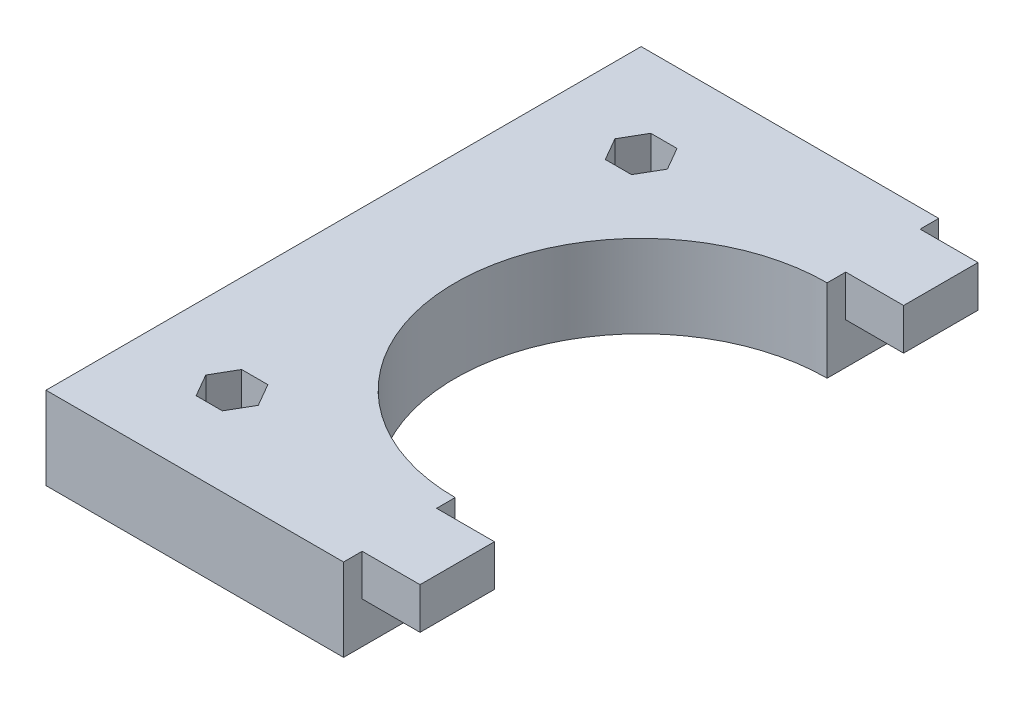
ISO-10303-21;
HEADER;
FILE_DESCRIPTION(('STEP AP214'),'2;1');
FILE_NAME('part.step','',(''),(''),'','','');
FILE_SCHEMA(('AUTOMOTIVE_DESIGN { 1 0 10303 214 1 1 1 1 }'));
ENDSEC;
DATA;
#1=APPLICATION_CONTEXT('core data for automotive mechanical design processes');
#2=APPLICATION_PROTOCOL_DEFINITION('international standard','automotive_design',2000,#1);
#3=PRODUCT_CONTEXT('',#1,'mechanical');
#4=PRODUCT('Part','Part','',(#3));
#5=PRODUCT_RELATED_PRODUCT_CATEGORY('part','',(#4));
#6=PRODUCT_DEFINITION_FORMATION('','',#4);
#7=PRODUCT_DEFINITION_CONTEXT('part definition',#1,'design');
#8=PRODUCT_DEFINITION('design','',#6,#7);
#9=PRODUCT_DEFINITION_SHAPE('','',#8);
#10=(LENGTH_UNIT() NAMED_UNIT(*) SI_UNIT(.MILLI.,.METRE.));
#11=(NAMED_UNIT(*) PLANE_ANGLE_UNIT() SI_UNIT($,.RADIAN.));
#12=(NAMED_UNIT(*) SI_UNIT($,.STERADIAN.) SOLID_ANGLE_UNIT());
#13=UNCERTAINTY_MEASURE_WITH_UNIT(LENGTH_MEASURE(1.E-05),#10,'distance_accuracy_value','');
#14=(GEOMETRIC_REPRESENTATION_CONTEXT(3) GLOBAL_UNCERTAINTY_ASSIGNED_CONTEXT((#13)) GLOBAL_UNIT_ASSIGNED_CONTEXT((#10,
#11,#12)) REPRESENTATION_CONTEXT('',''));
#15=CARTESIAN_POINT('',(0.,0.,0.));
#16=DIRECTION('',(0.,0.,1.));
#17=DIRECTION('',(1.,0.,0.));
#18=AXIS2_PLACEMENT_3D('',#15,#16,#17);
#19=CARTESIAN_POINT('',(0.,-5.,0.));
#20=DIRECTION('',(-1.,0.,0.));
#21=DIRECTION('',(0.,0.,1.));
#22=AXIS2_PLACEMENT_3D('',#19,#20,#21);
#23=PLANE('',#22);
#24=DIRECTION('',(0.,1.,0.));
#25=VECTOR('',#24,1.);
#26=CARTESIAN_POINT('',(0.,0.,-33.75));
#27=LINE('',#26,#25);
#28=CARTESIAN_POINT('',(0.,0.,-33.75));
#29=VERTEX_POINT('',#28);
#30=CARTESIAN_POINT('',(0.,5.,-33.75));
#31=VERTEX_POINT('',#30);
#32=EDGE_CURVE('E65',#29,#31,#27,.T.);
#33=ORIENTED_EDGE('',*,*,#32,.F.);
#34=DIRECTION('',(0.,0.,-1.));
#35=VECTOR('',#34,1.);
#36=CARTESIAN_POINT('',(0.,0.,-24.75));
#37=LINE('',#36,#35);
#38=CARTESIAN_POINT('',(0.,0.,-24.75));
#39=VERTEX_POINT('',#38);
#40=EDGE_CURVE('E70',#39,#29,#37,.T.);
#41=ORIENTED_EDGE('',*,*,#40,.F.);
#42=DIRECTION('',(0.,1.,0.));
#43=VECTOR('',#42,1.);
#44=CARTESIAN_POINT('',(0.,0.,-24.75));
#45=LINE('',#44,#43);
#46=CARTESIAN_POINT('',(0.,5.,-24.75));
#47=VERTEX_POINT('',#46);
#48=EDGE_CURVE('E243',#39,#47,#45,.T.);
#49=ORIENTED_EDGE('',*,*,#48,.T.);
#50=DIRECTION('',(0.,0.,1.));
#51=VECTOR('',#50,1.);
#52=CARTESIAN_POINT('',(0.,5.,0.));
#53=LINE('',#52,#51);
#54=CARTESIAN_POINT('',(0.,5.,-22.5));
#55=VERTEX_POINT('',#54);
#56=EDGE_CURVE('E442',#47,#55,#53,.T.);
#57=ORIENTED_EDGE('',*,*,#56,.T.);
#58=DIRECTION('',(0.,1.,0.));
#59=VECTOR('',#58,1.);
#60=CARTESIAN_POINT('',(0.,-5.,-22.5));
#61=LINE('',#60,#59);
#62=CARTESIAN_POINT('',(0.,-5.,-22.5));
#63=VERTEX_POINT('',#62);
#64=EDGE_CURVE('E498',#63,#55,#61,.T.);
#65=ORIENTED_EDGE('',*,*,#64,.F.);
#66=DIRECTION('',(0.,0.,1.));
#67=VECTOR('',#66,1.);
#68=CARTESIAN_POINT('',(0.,-5.,0.));
#69=LINE('',#68,#67);
#70=CARTESIAN_POINT('',(0.,-5.,-36.));
#71=VERTEX_POINT('',#70);
#72=EDGE_CURVE('E472',#71,#63,#69,.T.);
#73=ORIENTED_EDGE('',*,*,#72,.F.);
#74=DIRECTION('',(0.,1.,0.));
#75=VECTOR('',#74,1.);
#76=CARTESIAN_POINT('',(0.,-5.,-36.));
#77=LINE('',#76,#75);
#78=CARTESIAN_POINT('',(0.,5.,-36.));
#79=VERTEX_POINT('',#78);
#80=EDGE_CURVE('E495',#71,#79,#77,.T.);
#81=ORIENTED_EDGE('',*,*,#80,.T.);
#82=EDGE_CURVE('E443',#79,#31,#53,.T.);
#83=ORIENTED_EDGE('',*,*,#82,.T.);
#84=EDGE_LOOP('',(#33,#41,#49,#57,#65,#73,#81,#83));
#85=FACE_BOUND('',#84,.T.);
#86=ADVANCED_FACE('F47',(#85),#23,.F.);
#87=CARTESIAN_POINT('',(-24.7487373415292,-5.,24.7487373415292));
#88=DIRECTION('',(0.,1.,0.));
#89=DIRECTION('',(0.,0.,1.));
#90=AXIS2_PLACEMENT_3D('',#87,#88,#89);
#91=CYLINDRICAL_SURFACE('',#90,1.5);
#92=CARTESIAN_POINT('',(-24.7487373415292,-5.,24.7487373415292));
#93=DIRECTION('',(0.,1.,0.));
#94=DIRECTION('',(0.,0.,1.));
#95=AXIS2_PLACEMENT_3D('',#92,#93,#94);
#96=CIRCLE('',#95,1.5);
#97=CARTESIAN_POINT('',(-24.7487373415292,-5.,26.2487373415292));
#98=VERTEX_POINT('',#97);
#99=EDGE_CURVE('E460',#98,#98,#96,.T.);
#100=ORIENTED_EDGE('',*,*,#99,.F.);
#101=EDGE_LOOP('',(#100));
#102=FACE_BOUND('',#101,.T.);
#103=CARTESIAN_POINT('',(-24.7487373415292,0.,24.7487373415292));
#104=DIRECTION('',(0.,1.,0.));
#105=DIRECTION('',(0.,0.,1.));
#106=AXIS2_PLACEMENT_3D('',#103,#104,#105);
#107=CIRCLE('',#106,1.5);
#108=CARTESIAN_POINT('',(-24.7487373415292,0.,26.2487373415292));
#109=VERTEX_POINT('',#108);
#110=EDGE_CURVE('E51',#109,#109,#107,.F.);
#111=ORIENTED_EDGE('',*,*,#110,.F.);
#112=EDGE_LOOP('',(#111));
#113=FACE_BOUND('',#112,.T.);
#114=ADVANCED_FACE('F49',(#102,#113),#91,.F.);
#115=CARTESIAN_POINT('',(0.,5.,0.));
#116=DIRECTION('',(0.,1.,0.));
#117=DIRECTION('',(0.,0.,1.));
#118=AXIS2_PLACEMENT_3D('',#115,#116,#117);
#119=PLANE('',#118);
#120=CARTESIAN_POINT('',(0.,5.,0.));
#121=DIRECTION('',(0.,1.,0.));
#122=DIRECTION('',(0.,0.,1.));
#123=AXIS2_PLACEMENT_3D('',#120,#121,#122);
#124=CIRCLE('',#123,22.5);
#125=CARTESIAN_POINT('',(0.,5.,22.5));
#126=VERTEX_POINT('',#125);
#127=EDGE_CURVE('E438',#55,#126,#124,.T.);
#128=ORIENTED_EDGE('',*,*,#127,.F.);
#129=ORIENTED_EDGE('',*,*,#56,.F.);
#130=DIRECTION('',(-1.,0.,0.));
#131=VECTOR('',#130,1.);
#132=CARTESIAN_POINT('',(0.,5.,-24.75));
#133=LINE('',#132,#131);
#134=CARTESIAN_POINT('',(7.,5.,-24.75));
#135=VERTEX_POINT('',#134);
#136=EDGE_CURVE('E254',#135,#47,#133,.T.);
#137=ORIENTED_EDGE('',*,*,#136,.F.);
#138=DIRECTION('',(0.,0.,1.));
#139=VECTOR('',#138,1.);
#140=CARTESIAN_POINT('',(7.,5.,-24.75));
#141=LINE('',#140,#139);
#142=CARTESIAN_POINT('',(7.,5.,-33.75));
#143=VERTEX_POINT('',#142);
#144=EDGE_CURVE('E237',#143,#135,#141,.T.);
#145=ORIENTED_EDGE('',*,*,#144,.F.);
#146=DIRECTION('',(1.,0.,0.));
#147=VECTOR('',#146,1.);
#148=CARTESIAN_POINT('',(0.,5.,-33.75));
#149=LINE('',#148,#147);
#150=EDGE_CURVE('E249',#31,#143,#149,.T.);
#151=ORIENTED_EDGE('',*,*,#150,.F.);
#152=ORIENTED_EDGE('',*,*,#82,.F.);
#153=DIRECTION('',(1.,0.,0.));
#154=VECTOR('',#153,1.);
#155=CARTESIAN_POINT('',(0.,5.,-36.));
#156=LINE('',#155,#154);
#157=CARTESIAN_POINT('',(-36.,5.,-36.));
#158=VERTEX_POINT('',#157);
#159=EDGE_CURVE('E446',#158,#79,#156,.T.);
#160=ORIENTED_EDGE('',*,*,#159,.F.);
#161=DIRECTION('',(0.,0.,-1.));
#162=VECTOR('',#161,1.);
#163=CARTESIAN_POINT('',(-36.,5.,0.));
#164=LINE('',#163,#162);
#165=CARTESIAN_POINT('',(-36.,5.,36.));
#166=VERTEX_POINT('',#165);
#167=EDGE_CURVE('E451',#166,#158,#164,.T.);
#168=ORIENTED_EDGE('',*,*,#167,.F.);
#169=DIRECTION('',(1.,0.,0.));
#170=VECTOR('',#169,1.);
#171=CARTESIAN_POINT('',(0.,5.,36.));
#172=LINE('',#171,#170);
#173=CARTESIAN_POINT('',(0.,5.,36.));
#174=VERTEX_POINT('',#173);
#175=EDGE_CURVE('E455',#166,#174,#172,.T.);
#176=ORIENTED_EDGE('',*,*,#175,.T.);
#177=CARTESIAN_POINT('',(0.,5.,33.75));
#178=VERTEX_POINT('',#177);
#179=EDGE_CURVE('E459',#178,#174,#53,.T.);
#180=ORIENTED_EDGE('',*,*,#179,.F.);
#181=DIRECTION('',(1.,0.,0.));
#182=VECTOR('',#181,1.);
#183=CARTESIAN_POINT('',(0.,5.,33.75));
#184=LINE('',#183,#182);
#185=CARTESIAN_POINT('',(7.,5.,33.75));
#186=VERTEX_POINT('',#185);
#187=EDGE_CURVE('E263',#178,#186,#184,.T.);
#188=ORIENTED_EDGE('',*,*,#187,.T.);
#189=DIRECTION('',(0.,0.,-1.));
#190=VECTOR('',#189,1.);
#191=CARTESIAN_POINT('',(7.,5.,24.75));
#192=LINE('',#191,#190);
#193=CARTESIAN_POINT('',(7.,5.,24.75));
#194=VERTEX_POINT('',#193);
#195=EDGE_CURVE('E288',#186,#194,#192,.T.);
#196=ORIENTED_EDGE('',*,*,#195,.T.);
#197=DIRECTION('',(-1.,0.,0.));
#198=VECTOR('',#197,1.);
#199=CARTESIAN_POINT('',(0.,5.,24.75));
#200=LINE('',#199,#198);
#201=CARTESIAN_POINT('',(0.,5.,24.75));
#202=VERTEX_POINT('',#201);
#203=EDGE_CURVE('E272',#194,#202,#200,.T.);
#204=ORIENTED_EDGE('',*,*,#203,.T.);
#205=EDGE_CURVE('E447',#126,#202,#53,.T.);
#206=ORIENTED_EDGE('',*,*,#205,.F.);
#207=EDGE_LOOP('',(#128,#129,#137,#145,#151,#152,#160,#168,#176,#180,#188,#196,#204,#206));
#208=FACE_BOUND('',#207,.T.);
#209=DIRECTION('',(-0.500000000000006,0.,-0.866025403784435));
#210=VECTOR('',#209,1.);
#211=CARTESIAN_POINT('',(-21.5733108609862,5.,-24.7487373415292));
#212=LINE('',#211,#210);
#213=CARTESIAN_POINT('',(-21.5733108609862,5.,-24.7487373415292));
#214=VERTEX_POINT('',#213);
#215=CARTESIAN_POINT('',(-23.1610241012577,5.,-27.4987373415292));
#216=VERTEX_POINT('',#215);
#217=EDGE_CURVE('E397',#214,#216,#212,.T.);
#218=ORIENTED_EDGE('',*,*,#217,.F.);
#219=DIRECTION('',(0.499999999999995,0.,-0.866025403784442));
#220=VECTOR('',#219,1.);
#221=CARTESIAN_POINT('',(-23.1610241012577,5.,-21.9987373415292));
#222=LINE('',#221,#220);
#223=CARTESIAN_POINT('',(-23.1610241012577,5.,-21.9987373415292));
#224=VERTEX_POINT('',#223);
#225=EDGE_CURVE('E376',#224,#214,#222,.T.);
#226=ORIENTED_EDGE('',*,*,#225,.F.);
#227=DIRECTION('',(1.,0.,0.));
#228=VECTOR('',#227,1.);
#229=CARTESIAN_POINT('',(-26.3364505818006,5.,-21.9987373415292));
#230=LINE('',#229,#228);
#231=CARTESIAN_POINT('',(-26.3364505818006,5.,-21.9987373415292));
#232=VERTEX_POINT('',#231);
#233=EDGE_CURVE('E412',#232,#224,#230,.T.);
#234=ORIENTED_EDGE('',*,*,#233,.F.);
#235=DIRECTION('',(0.500000000000006,0.,0.866025403784435));
#236=VECTOR('',#235,1.);
#237=CARTESIAN_POINT('',(-27.9241638220721,5.,-24.7487373415291));
#238=LINE('',#237,#236);
#239=CARTESIAN_POINT('',(-27.9241638220721,5.,-24.7487373415291));
#240=VERTEX_POINT('',#239);
#241=EDGE_CURVE('E408',#240,#232,#238,.T.);
#242=ORIENTED_EDGE('',*,*,#241,.F.);
#243=DIRECTION('',(-0.499999999999993,0.,0.866025403784443));
#244=VECTOR('',#243,1.);
#245=CARTESIAN_POINT('',(-26.3364505818006,5.,-27.4987373415292));
#246=LINE('',#245,#244);
#247=CARTESIAN_POINT('',(-26.3364505818006,5.,-27.4987373415292));
#248=VERTEX_POINT('',#247);
#249=EDGE_CURVE('E404',#248,#240,#246,.T.);
#250=ORIENTED_EDGE('',*,*,#249,.F.);
#251=DIRECTION('',(-1.,0.,0.));
#252=VECTOR('',#251,1.);
#253=CARTESIAN_POINT('',(-23.1610241012577,5.,-27.4987373415292));
#254=LINE('',#253,#252);
#255=EDGE_CURVE('E400',#216,#248,#254,.T.);
#256=ORIENTED_EDGE('',*,*,#255,.F.);
#257=EDGE_LOOP('',(#218,#226,#234,#242,#250,#256));
#258=FACE_BOUND('',#257,.T.);
#259=DIRECTION('',(0.499999999999995,0.,0.866025403784442));
#260=VECTOR('',#259,1.);
#261=CARTESIAN_POINT('',(-23.1610241012577,5.,21.9987373415292));
#262=LINE('',#261,#260);
#263=CARTESIAN_POINT('',(-23.1610241012577,5.,21.9987373415292));
#264=VERTEX_POINT('',#263);
#265=CARTESIAN_POINT('',(-21.5733108609862,5.,24.7487373415292));
#266=VERTEX_POINT('',#265);
#267=EDGE_CURVE('E333',#264,#266,#262,.T.);
#268=ORIENTED_EDGE('',*,*,#267,.T.);
#269=DIRECTION('',(-0.500000000000006,0.,0.866025403784435));
#270=VECTOR('',#269,1.);
#271=CARTESIAN_POINT('',(-21.5733108609862,5.,24.7487373415292));
#272=LINE('',#271,#270);
#273=CARTESIAN_POINT('',(-23.1610241012577,5.,27.4987373415292));
#274=VERTEX_POINT('',#273);
#275=EDGE_CURVE('E299',#266,#274,#272,.T.);
#276=ORIENTED_EDGE('',*,*,#275,.T.);
#277=DIRECTION('',(-1.,0.,0.));
#278=VECTOR('',#277,1.);
#279=CARTESIAN_POINT('',(-23.1610241012577,5.,27.4987373415292));
#280=LINE('',#279,#278);
#281=CARTESIAN_POINT('',(-26.3364505818006,5.,27.4987373415292));
#282=VERTEX_POINT('',#281);
#283=EDGE_CURVE('E314',#274,#282,#280,.T.);
#284=ORIENTED_EDGE('',*,*,#283,.T.);
#285=DIRECTION('',(-0.499999999999993,0.,-0.866025403784443));
#286=VECTOR('',#285,1.);
#287=CARTESIAN_POINT('',(-26.3364505818006,5.,27.4987373415292));
#288=LINE('',#287,#286);
#289=CARTESIAN_POINT('',(-27.9241638220721,5.,24.7487373415291));
#290=VERTEX_POINT('',#289);
#291=EDGE_CURVE('E345',#282,#290,#288,.T.);
#292=ORIENTED_EDGE('',*,*,#291,.T.);
#293=DIRECTION('',(0.500000000000006,0.,-0.866025403784435));
#294=VECTOR('',#293,1.);
#295=CARTESIAN_POINT('',(-27.9241638220721,5.,24.7487373415291));
#296=LINE('',#295,#294);
#297=CARTESIAN_POINT('',(-26.3364505818006,5.,21.9987373415292));
#298=VERTEX_POINT('',#297);
#299=EDGE_CURVE('E341',#290,#298,#296,.T.);
#300=ORIENTED_EDGE('',*,*,#299,.T.);
#301=DIRECTION('',(1.,0.,0.));
#302=VECTOR('',#301,1.);
#303=CARTESIAN_POINT('',(-26.3364505818006,5.,21.9987373415292));
#304=LINE('',#303,#302);
#305=EDGE_CURVE('E337',#298,#264,#304,.T.);
#306=ORIENTED_EDGE('',*,*,#305,.T.);
#307=EDGE_LOOP('',(#268,#276,#284,#292,#300,#306));
#308=FACE_BOUND('',#307,.T.);
#309=ADVANCED_FACE('F510',(#208,#258,#308),#119,.T.);
#310=CARTESIAN_POINT('',(-24.7487373415292,-5.,-24.7487373415292));
#311=DIRECTION('',(0.,1.,0.));
#312=DIRECTION('',(0.,0.,1.));
#313=AXIS2_PLACEMENT_3D('',#310,#311,#312);
#314=CYLINDRICAL_SURFACE('',#313,1.5);
#315=CARTESIAN_POINT('',(-24.7487373415292,-5.,-24.7487373415292));
#316=DIRECTION('',(0.,1.,0.));
#317=DIRECTION('',(0.,0.,1.));
#318=AXIS2_PLACEMENT_3D('',#315,#316,#317);
#319=CIRCLE('',#318,1.5);
#320=CARTESIAN_POINT('',(-24.7487373415292,-5.,-23.2487373415292));
#321=VERTEX_POINT('',#320);
#322=EDGE_CURVE('E464',#321,#321,#319,.T.);
#323=ORIENTED_EDGE('',*,*,#322,.F.);
#324=EDGE_LOOP('',(#323));
#325=FACE_BOUND('',#324,.T.);
#326=CARTESIAN_POINT('',(-24.7487373415292,0.,-24.7487373415292));
#327=DIRECTION('',(0.,1.,0.));
#328=DIRECTION('',(0.,0.,1.));
#329=AXIS2_PLACEMENT_3D('',#326,#327,#328);
#330=CIRCLE('',#329,1.5);
#331=CARTESIAN_POINT('',(-24.7487373415292,0.,-23.2487373415292));
#332=VERTEX_POINT('',#331);
#333=EDGE_CURVE('E422',#332,#332,#330,.F.);
#334=ORIENTED_EDGE('',*,*,#333,.F.);
#335=EDGE_LOOP('',(#334));
#336=FACE_BOUND('',#335,.T.);
#337=ADVANCED_FACE('F507',(#325,#336),#314,.F.);
#338=CARTESIAN_POINT('',(0.,-5.,0.));
#339=DIRECTION('',(0.,1.,0.));
#340=DIRECTION('',(0.,0.,1.));
#341=AXIS2_PLACEMENT_3D('',#338,#339,#340);
#342=CYLINDRICAL_SURFACE('',#341,22.5);
#343=ORIENTED_EDGE('',*,*,#64,.T.);
#344=ORIENTED_EDGE('',*,*,#127,.T.);
#345=DIRECTION('',(0.,1.,0.));
#346=VECTOR('',#345,1.);
#347=CARTESIAN_POINT('',(0.,-5.,22.5));
#348=LINE('',#347,#346);
#349=CARTESIAN_POINT('',(0.,-5.,22.5));
#350=VERTEX_POINT('',#349);
#351=EDGE_CURVE('E11',#350,#126,#348,.T.);
#352=ORIENTED_EDGE('',*,*,#351,.F.);
#353=CARTESIAN_POINT('',(0.,-5.,0.));
#354=DIRECTION('',(0.,1.,0.));
#355=DIRECTION('',(0.,0.,1.));
#356=AXIS2_PLACEMENT_3D('',#353,#354,#355);
#357=CIRCLE('',#356,22.5);
#358=EDGE_CURVE('E468',#63,#350,#357,.T.);
#359=ORIENTED_EDGE('',*,*,#358,.F.);
#360=EDGE_LOOP('',(#343,#344,#352,#359));
#361=FACE_BOUND('',#360,.T.);
#362=ADVANCED_FACE('F509',(#361),#342,.F.);
#363=ORIENTED_EDGE('',*,*,#205,.T.);
#364=DIRECTION('',(0.,1.,0.));
#365=VECTOR('',#364,1.);
#366=CARTESIAN_POINT('',(0.,0.,24.75));
#367=LINE('',#366,#365);
#368=CARTESIAN_POINT('',(0.,0.,24.75));
#369=VERTEX_POINT('',#368);
#370=EDGE_CURVE('E295',#369,#202,#367,.T.);
#371=ORIENTED_EDGE('',*,*,#370,.F.);
#372=DIRECTION('',(0.,0.,1.));
#373=VECTOR('',#372,1.);
#374=CARTESIAN_POINT('',(0.,0.,24.75));
#375=LINE('',#374,#373);
#376=CARTESIAN_POINT('',(0.,0.,33.75));
#377=VERTEX_POINT('',#376);
#378=EDGE_CURVE('E268',#369,#377,#375,.T.);
#379=ORIENTED_EDGE('',*,*,#378,.T.);
#380=DIRECTION('',(0.,1.,0.));
#381=VECTOR('',#380,1.);
#382=CARTESIAN_POINT('',(0.,0.,33.75));
#383=LINE('',#382,#381);
#384=EDGE_CURVE('E284',#377,#178,#383,.T.);
#385=ORIENTED_EDGE('',*,*,#384,.T.);
#386=ORIENTED_EDGE('',*,*,#179,.T.);
#387=DIRECTION('',(0.,1.,0.));
#388=VECTOR('',#387,1.);
#389=CARTESIAN_POINT('',(0.,-5.,36.));
#390=LINE('',#389,#388);
#391=CARTESIAN_POINT('',(0.,-5.,36.));
#392=VERTEX_POINT('',#391);
#393=EDGE_CURVE('E57',#392,#174,#390,.T.);
#394=ORIENTED_EDGE('',*,*,#393,.F.);
#395=EDGE_CURVE('E476',#350,#392,#69,.T.);
#396=ORIENTED_EDGE('',*,*,#395,.F.);
#397=ORIENTED_EDGE('',*,*,#351,.T.);
#398=EDGE_LOOP('',(#363,#371,#379,#385,#386,#394,#396,#397));
#399=FACE_BOUND('',#398,.T.);
#400=ADVANCED_FACE('F517',(#399),#23,.F.);
#401=CARTESIAN_POINT('',(0.,-5.,36.));
#402=DIRECTION('',(0.,0.,1.));
#403=DIRECTION('',(1.,0.,0.));
#404=AXIS2_PLACEMENT_3D('',#401,#402,#403);
#405=PLANE('',#404);
#406=ORIENTED_EDGE('',*,*,#393,.T.);
#407=ORIENTED_EDGE('',*,*,#175,.F.);
#408=DIRECTION('',(0.,1.,0.));
#409=VECTOR('',#408,1.);
#410=CARTESIAN_POINT('',(-36.,-5.,36.));
#411=LINE('',#410,#409);
#412=CARTESIAN_POINT('',(-36.,-5.,36.));
#413=VERTEX_POINT('',#412);
#414=EDGE_CURVE('E489',#413,#166,#411,.T.);
#415=ORIENTED_EDGE('',*,*,#414,.F.);
#416=DIRECTION('',(1.,0.,0.));
#417=VECTOR('',#416,1.);
#418=CARTESIAN_POINT('',(0.,-5.,36.));
#419=LINE('',#418,#417);
#420=EDGE_CURVE('E482',#413,#392,#419,.T.);
#421=ORIENTED_EDGE('',*,*,#420,.T.);
#422=EDGE_LOOP('',(#406,#407,#415,#421));
#423=FACE_BOUND('',#422,.T.);
#424=ADVANCED_FACE('F534',(#423),#405,.T.);
#425=CARTESIAN_POINT('',(-36.,-5.,0.));
#426=DIRECTION('',(1.,0.,0.));
#427=DIRECTION('',(0.,0.,-1.));
#428=AXIS2_PLACEMENT_3D('',#425,#426,#427);
#429=PLANE('',#428);
#430=ORIENTED_EDGE('',*,*,#414,.T.);
#431=ORIENTED_EDGE('',*,*,#167,.T.);
#432=DIRECTION('',(0.,1.,0.));
#433=VECTOR('',#432,1.);
#434=CARTESIAN_POINT('',(-36.,-5.,-36.));
#435=LINE('',#434,#433);
#436=CARTESIAN_POINT('',(-36.,-5.,-36.));
#437=VERTEX_POINT('',#436);
#438=EDGE_CURVE('E492',#437,#158,#435,.T.);
#439=ORIENTED_EDGE('',*,*,#438,.F.);
#440=DIRECTION('',(0.,0.,-1.));
#441=VECTOR('',#440,1.);
#442=CARTESIAN_POINT('',(-36.,-5.,0.));
#443=LINE('',#442,#441);
#444=EDGE_CURVE('E479',#413,#437,#443,.T.);
#445=ORIENTED_EDGE('',*,*,#444,.F.);
#446=EDGE_LOOP('',(#430,#431,#439,#445));
#447=FACE_BOUND('',#446,.T.);
#448=ADVANCED_FACE('F541',(#447),#429,.F.);
#449=CARTESIAN_POINT('',(0.,-5.,-36.));
#450=DIRECTION('',(0.,0.,1.));
#451=DIRECTION('',(1.,0.,0.));
#452=AXIS2_PLACEMENT_3D('',#449,#450,#451);
#453=PLANE('',#452);
#454=ORIENTED_EDGE('',*,*,#438,.T.);
#455=ORIENTED_EDGE('',*,*,#159,.T.);
#456=ORIENTED_EDGE('',*,*,#80,.F.);
#457=DIRECTION('',(1.,0.,0.));
#458=VECTOR('',#457,1.);
#459=CARTESIAN_POINT('',(0.,-5.,-36.));
#460=LINE('',#459,#458);
#461=EDGE_CURVE('E475',#437,#71,#460,.T.);
#462=ORIENTED_EDGE('',*,*,#461,.F.);
#463=EDGE_LOOP('',(#454,#455,#456,#462));
#464=FACE_BOUND('',#463,.T.);
#465=ADVANCED_FACE('F627',(#464),#453,.F.);
#466=CARTESIAN_POINT('',(0.,-5.,0.));
#467=DIRECTION('',(0.,1.,0.));
#468=DIRECTION('',(0.,0.,1.));
#469=AXIS2_PLACEMENT_3D('',#466,#467,#468);
#470=PLANE('',#469);
#471=ORIENTED_EDGE('',*,*,#99,.T.);
#472=EDGE_LOOP('',(#471));
#473=FACE_BOUND('',#472,.T.);
#474=ORIENTED_EDGE('',*,*,#322,.T.);
#475=EDGE_LOOP('',(#474));
#476=FACE_BOUND('',#475,.T.);
#477=ORIENTED_EDGE('',*,*,#358,.T.);
#478=ORIENTED_EDGE('',*,*,#395,.T.);
#479=ORIENTED_EDGE('',*,*,#420,.F.);
#480=ORIENTED_EDGE('',*,*,#444,.T.);
#481=ORIENTED_EDGE('',*,*,#461,.T.);
#482=ORIENTED_EDGE('',*,*,#72,.T.);
#483=EDGE_LOOP('',(#477,#478,#479,#480,#481,#482));
#484=FACE_BOUND('',#483,.T.);
#485=ADVANCED_FACE('F604',(#473,#476,#484),#470,.F.);
#486=CARTESIAN_POINT('',(0.,0.,0.));
#487=DIRECTION('',(0.,1.,0.));
#488=DIRECTION('',(0.,0.,1.));
#489=AXIS2_PLACEMENT_3D('',#486,#487,#488);
#490=PLANE('',#489);
#491=DIRECTION('',(-0.500000000000006,0.,-0.866025403784435));
#492=VECTOR('',#491,1.);
#493=CARTESIAN_POINT('',(-21.5733108609862,0.,-24.7487373415292));
#494=LINE('',#493,#492);
#495=CARTESIAN_POINT('',(-21.5733108609862,0.,-24.7487373415292));
#496=VERTEX_POINT('',#495);
#497=CARTESIAN_POINT('',(-23.1610241012577,0.,-27.4987373415292));
#498=VERTEX_POINT('',#497);
#499=EDGE_CURVE('E371',#496,#498,#494,.T.);
#500=ORIENTED_EDGE('',*,*,#499,.T.);
#501=DIRECTION('',(-1.,0.,0.));
#502=VECTOR('',#501,1.);
#503=CARTESIAN_POINT('',(-23.1610241012577,0.,-27.4987373415292));
#504=LINE('',#503,#502);
#505=CARTESIAN_POINT('',(-26.3364505818006,0.,-27.4987373415292));
#506=VERTEX_POINT('',#505);
#507=EDGE_CURVE('E375',#498,#506,#504,.T.);
#508=ORIENTED_EDGE('',*,*,#507,.T.);
#509=DIRECTION('',(-0.499999999999993,0.,0.866025403784443));
#510=VECTOR('',#509,1.);
#511=CARTESIAN_POINT('',(-26.3364505818006,0.,-27.4987373415292));
#512=LINE('',#511,#510);
#513=CARTESIAN_POINT('',(-27.9241638220721,0.,-24.7487373415291));
#514=VERTEX_POINT('',#513);
#515=EDGE_CURVE('E380',#506,#514,#512,.T.);
#516=ORIENTED_EDGE('',*,*,#515,.T.);
#517=DIRECTION('',(0.500000000000006,0.,0.866025403784435));
#518=VECTOR('',#517,1.);
#519=CARTESIAN_POINT('',(-27.9241638220721,0.,-24.7487373415291));
#520=LINE('',#519,#518);
#521=CARTESIAN_POINT('',(-26.3364505818006,0.,-21.9987373415292));
#522=VERTEX_POINT('',#521);
#523=EDGE_CURVE('E384',#514,#522,#520,.T.);
#524=ORIENTED_EDGE('',*,*,#523,.T.);
#525=DIRECTION('',(1.,0.,0.));
#526=VECTOR('',#525,1.);
#527=CARTESIAN_POINT('',(-26.3364505818006,0.,-21.9987373415292));
#528=LINE('',#527,#526);
#529=CARTESIAN_POINT('',(-23.1610241012577,0.,-21.9987373415292));
#530=VERTEX_POINT('',#529);
#531=EDGE_CURVE('E388',#522,#530,#528,.T.);
#532=ORIENTED_EDGE('',*,*,#531,.T.);
#533=DIRECTION('',(0.499999999999995,0.,-0.866025403784442));
#534=VECTOR('',#533,1.);
#535=CARTESIAN_POINT('',(-23.1610241012577,0.,-21.9987373415292));
#536=LINE('',#535,#534);
#537=EDGE_CURVE('E392',#530,#496,#536,.T.);
#538=ORIENTED_EDGE('',*,*,#537,.T.);
#539=EDGE_LOOP('',(#500,#508,#516,#524,#532,#538));
#540=FACE_BOUND('',#539,.T.);
#541=ORIENTED_EDGE('',*,*,#333,.T.);
#542=EDGE_LOOP('',(#541));
#543=FACE_BOUND('',#542,.T.);
#544=ADVANCED_FACE('F505',(#540,#543),#490,.T.);
#545=CARTESIAN_POINT('',(-21.5733108609862,0.,-24.7487373415292));
#546=DIRECTION('',(0.866025403784435,0.,-0.500000000000006));
#547=DIRECTION('',(-0.500000000000006,0.,-0.866025403784435));
#548=AXIS2_PLACEMENT_3D('',#545,#546,#547);
#549=PLANE('',#548);
#550=ORIENTED_EDGE('',*,*,#217,.T.);
#551=DIRECTION('',(0.,1.,0.));
#552=VECTOR('',#551,1.);
#553=CARTESIAN_POINT('',(-23.1610241012577,0.,-27.4987373415292));
#554=LINE('',#553,#552);
#555=EDGE_CURVE('E396',#498,#216,#554,.T.);
#556=ORIENTED_EDGE('',*,*,#555,.F.);
#557=ORIENTED_EDGE('',*,*,#499,.F.);
#558=DIRECTION('',(0.,1.,0.));
#559=VECTOR('',#558,1.);
#560=CARTESIAN_POINT('',(-21.5733108609862,0.,-24.7487373415292));
#561=LINE('',#560,#559);
#562=EDGE_CURVE('E419',#496,#214,#561,.T.);
#563=ORIENTED_EDGE('',*,*,#562,.T.);
#564=EDGE_LOOP('',(#550,#556,#557,#563));
#565=FACE_BOUND('',#564,.T.);
#566=ADVANCED_FACE('F603',(#565),#549,.F.);
#567=CARTESIAN_POINT('',(-23.1610241012577,0.,-21.9987373415292));
#568=DIRECTION('',(0.866025403784442,0.,0.499999999999995));
#569=DIRECTION('',(0.499999999999995,0.,-0.866025403784442));
#570=AXIS2_PLACEMENT_3D('',#567,#568,#569);
#571=PLANE('',#570);
#572=ORIENTED_EDGE('',*,*,#225,.T.);
#573=ORIENTED_EDGE('',*,*,#562,.F.);
#574=ORIENTED_EDGE('',*,*,#537,.F.);
#575=DIRECTION('',(0.,1.,0.));
#576=VECTOR('',#575,1.);
#577=CARTESIAN_POINT('',(-23.1610241012577,0.,-21.9987373415292));
#578=LINE('',#577,#576);
#579=EDGE_CURVE('E423',#530,#224,#578,.T.);
#580=ORIENTED_EDGE('',*,*,#579,.T.);
#581=EDGE_LOOP('',(#572,#573,#574,#580));
#582=FACE_BOUND('',#581,.T.);
#583=ADVANCED_FACE('F606',(#582),#571,.F.);
#584=CARTESIAN_POINT('',(-26.3364505818006,0.,-21.9987373415292));
#585=DIRECTION('',(0.,0.,1.));
#586=DIRECTION('',(1.,0.,0.));
#587=AXIS2_PLACEMENT_3D('',#584,#585,#586);
#588=PLANE('',#587);
#589=ORIENTED_EDGE('',*,*,#233,.T.);
#590=ORIENTED_EDGE('',*,*,#579,.F.);
#591=ORIENTED_EDGE('',*,*,#531,.F.);
#592=DIRECTION('',(0.,1.,0.));
#593=VECTOR('',#592,1.);
#594=CARTESIAN_POINT('',(-26.3364505818006,0.,-21.9987373415292));
#595=LINE('',#594,#593);
#596=EDGE_CURVE('E426',#522,#232,#595,.T.);
#597=ORIENTED_EDGE('',*,*,#596,.T.);
#598=EDGE_LOOP('',(#589,#590,#591,#597));
#599=FACE_BOUND('',#598,.T.);
#600=ADVANCED_FACE('F609',(#599),#588,.F.);
#601=CARTESIAN_POINT('',(-27.9241638220721,0.,-24.7487373415291));
#602=DIRECTION('',(-0.866025403784435,0.,0.500000000000006));
#603=DIRECTION('',(0.500000000000006,0.,0.866025403784435));
#604=AXIS2_PLACEMENT_3D('',#601,#602,#603);
#605=PLANE('',#604);
#606=ORIENTED_EDGE('',*,*,#241,.T.);
#607=ORIENTED_EDGE('',*,*,#596,.F.);
#608=ORIENTED_EDGE('',*,*,#523,.F.);
#609=DIRECTION('',(0.,1.,0.));
#610=VECTOR('',#609,1.);
#611=CARTESIAN_POINT('',(-27.9241638220721,0.,-24.7487373415291));
#612=LINE('',#611,#610);
#613=EDGE_CURVE('E429',#514,#240,#612,.T.);
#614=ORIENTED_EDGE('',*,*,#613,.T.);
#615=EDGE_LOOP('',(#606,#607,#608,#614));
#616=FACE_BOUND('',#615,.T.);
#617=ADVANCED_FACE('F613',(#616),#605,.F.);
#618=CARTESIAN_POINT('',(-26.3364505818006,0.,-27.4987373415292));
#619=DIRECTION('',(-0.866025403784442,0.,-0.499999999999993));
#620=DIRECTION('',(-0.499999999999993,0.,0.866025403784442));
#621=AXIS2_PLACEMENT_3D('',#618,#619,#620);
#622=PLANE('',#621);
#623=ORIENTED_EDGE('',*,*,#249,.T.);
#624=ORIENTED_EDGE('',*,*,#613,.F.);
#625=ORIENTED_EDGE('',*,*,#515,.F.);
#626=DIRECTION('',(0.,1.,0.));
#627=VECTOR('',#626,1.);
#628=CARTESIAN_POINT('',(-26.3364505818006,0.,-27.4987373415292));
#629=LINE('',#628,#627);
#630=EDGE_CURVE('E432',#506,#248,#629,.T.);
#631=ORIENTED_EDGE('',*,*,#630,.T.);
#632=EDGE_LOOP('',(#623,#624,#625,#631));
#633=FACE_BOUND('',#632,.T.);
#634=ADVANCED_FACE('F617',(#633),#622,.F.);
#635=CARTESIAN_POINT('',(-23.1610241012577,0.,-27.4987373415292));
#636=DIRECTION('',(0.,0.,-1.));
#637=DIRECTION('',(-1.,0.,0.));
#638=AXIS2_PLACEMENT_3D('',#635,#636,#637);
#639=PLANE('',#638);
#640=ORIENTED_EDGE('',*,*,#255,.T.);
#641=ORIENTED_EDGE('',*,*,#630,.F.);
#642=ORIENTED_EDGE('',*,*,#507,.F.);
#643=ORIENTED_EDGE('',*,*,#555,.T.);
#644=EDGE_LOOP('',(#640,#641,#642,#643));
#645=FACE_BOUND('',#644,.T.);
#646=ADVANCED_FACE('F578',(#645),#639,.F.);
#647=CARTESIAN_POINT('',(0.,0.,0.));
#648=DIRECTION('',(0.,1.,0.));
#649=DIRECTION('',(0.,0.,-1.));
#650=AXIS2_PLACEMENT_3D('',#647,#648,#649);
#651=PLANE('',#650);
#652=DIRECTION('',(-0.500000000000006,0.,0.866025403784435));
#653=VECTOR('',#652,1.);
#654=CARTESIAN_POINT('',(-21.5733108609862,0.,24.7487373415292));
#655=LINE('',#654,#653);
#656=CARTESIAN_POINT('',(-21.5733108609862,0.,24.7487373415292));
#657=VERTEX_POINT('',#656);
#658=CARTESIAN_POINT('',(-23.1610241012577,0.,27.4987373415292));
#659=VERTEX_POINT('',#658);
#660=EDGE_CURVE('E309',#657,#659,#655,.T.);
#661=ORIENTED_EDGE('',*,*,#660,.F.);
#662=DIRECTION('',(0.499999999999995,0.,0.866025403784442));
#663=VECTOR('',#662,1.);
#664=CARTESIAN_POINT('',(-23.1610241012577,0.,21.9987373415292));
#665=LINE('',#664,#663);
#666=CARTESIAN_POINT('',(-23.1610241012577,0.,21.9987373415292));
#667=VERTEX_POINT('',#666);
#668=EDGE_CURVE('E313',#667,#657,#665,.T.);
#669=ORIENTED_EDGE('',*,*,#668,.F.);
#670=DIRECTION('',(1.,0.,0.));
#671=VECTOR('',#670,1.);
#672=CARTESIAN_POINT('',(-26.3364505818006,0.,21.9987373415292));
#673=LINE('',#672,#671);
#674=CARTESIAN_POINT('',(-26.3364505818006,0.,21.9987373415292));
#675=VERTEX_POINT('',#674);
#676=EDGE_CURVE('E317',#675,#667,#673,.T.);
#677=ORIENTED_EDGE('',*,*,#676,.F.);
#678=DIRECTION('',(0.500000000000006,0.,-0.866025403784435));
#679=VECTOR('',#678,1.);
#680=CARTESIAN_POINT('',(-27.9241638220721,0.,24.7487373415291));
#681=LINE('',#680,#679);
#682=CARTESIAN_POINT('',(-27.9241638220721,0.,24.7487373415291));
#683=VERTEX_POINT('',#682);
#684=EDGE_CURVE('E320',#683,#675,#681,.T.);
#685=ORIENTED_EDGE('',*,*,#684,.F.);
#686=DIRECTION('',(-0.499999999999993,0.,-0.866025403784443));
#687=VECTOR('',#686,1.);
#688=CARTESIAN_POINT('',(-26.3364505818006,0.,27.4987373415292));
#689=LINE('',#688,#687);
#690=CARTESIAN_POINT('',(-26.3364505818006,0.,27.4987373415292));
#691=VERTEX_POINT('',#690);
#692=EDGE_CURVE('E323',#691,#683,#689,.T.);
#693=ORIENTED_EDGE('',*,*,#692,.F.);
#694=DIRECTION('',(-1.,0.,0.));
#695=VECTOR('',#694,1.);
#696=CARTESIAN_POINT('',(-23.1610241012577,0.,27.4987373415292));
#697=LINE('',#696,#695);
#698=EDGE_CURVE('E326',#659,#691,#697,.T.);
#699=ORIENTED_EDGE('',*,*,#698,.F.);
#700=EDGE_LOOP('',(#661,#669,#677,#685,#693,#699));
#701=FACE_BOUND('',#700,.T.);
#702=ORIENTED_EDGE('',*,*,#110,.T.);
#703=EDGE_LOOP('',(#702));
#704=FACE_BOUND('',#703,.T.);
#705=ADVANCED_FACE('F574',(#701,#704),#651,.T.);
#706=CARTESIAN_POINT('',(-21.5733108609862,0.,24.7487373415292));
#707=DIRECTION('',(-0.866025403784435,0.,-0.500000000000006));
#708=DIRECTION('',(-0.500000000000006,0.,0.866025403784435));
#709=AXIS2_PLACEMENT_3D('',#706,#707,#708);
#710=PLANE('',#709);
#711=ORIENTED_EDGE('',*,*,#275,.F.);
#712=DIRECTION('',(0.,1.,0.));
#713=VECTOR('',#712,1.);
#714=CARTESIAN_POINT('',(-21.5733108609862,0.,24.7487373415292));
#715=LINE('',#714,#713);
#716=EDGE_CURVE('E329',#657,#266,#715,.T.);
#717=ORIENTED_EDGE('',*,*,#716,.F.);
#718=ORIENTED_EDGE('',*,*,#660,.T.);
#719=DIRECTION('',(0.,1.,0.));
#720=VECTOR('',#719,1.);
#721=CARTESIAN_POINT('',(-23.1610241012577,0.,27.4987373415292));
#722=LINE('',#721,#720);
#723=EDGE_CURVE('E352',#659,#274,#722,.T.);
#724=ORIENTED_EDGE('',*,*,#723,.T.);
#725=EDGE_LOOP('',(#711,#717,#718,#724));
#726=FACE_BOUND('',#725,.T.);
#727=ADVANCED_FACE('F577',(#726),#710,.T.);
#728=CARTESIAN_POINT('',(-23.1610241012577,0.,27.4987373415292));
#729=DIRECTION('',(0.,0.,-1.));
#730=DIRECTION('',(-1.,0.,0.));
#731=AXIS2_PLACEMENT_3D('',#728,#729,#730);
#732=PLANE('',#731);
#733=ORIENTED_EDGE('',*,*,#283,.F.);
#734=ORIENTED_EDGE('',*,*,#723,.F.);
#735=ORIENTED_EDGE('',*,*,#698,.T.);
#736=DIRECTION('',(0.,1.,0.));
#737=VECTOR('',#736,1.);
#738=CARTESIAN_POINT('',(-26.3364505818006,0.,27.4987373415292));
#739=LINE('',#738,#737);
#740=EDGE_CURVE('E356',#691,#282,#739,.T.);
#741=ORIENTED_EDGE('',*,*,#740,.T.);
#742=EDGE_LOOP('',(#733,#734,#735,#741));
#743=FACE_BOUND('',#742,.T.);
#744=ADVANCED_FACE('F580',(#743),#732,.T.);
#745=CARTESIAN_POINT('',(-26.3364505818006,0.,27.4987373415292));
#746=DIRECTION('',(0.866025403784442,0.,-0.499999999999993));
#747=DIRECTION('',(-0.499999999999993,0.,-0.866025403784442));
#748=AXIS2_PLACEMENT_3D('',#745,#746,#747);
#749=PLANE('',#748);
#750=ORIENTED_EDGE('',*,*,#291,.F.);
#751=ORIENTED_EDGE('',*,*,#740,.F.);
#752=ORIENTED_EDGE('',*,*,#692,.T.);
#753=DIRECTION('',(0.,1.,0.));
#754=VECTOR('',#753,1.);
#755=CARTESIAN_POINT('',(-27.9241638220721,0.,24.7487373415291));
#756=LINE('',#755,#754);
#757=EDGE_CURVE('E359',#683,#290,#756,.T.);
#758=ORIENTED_EDGE('',*,*,#757,.T.);
#759=EDGE_LOOP('',(#750,#751,#752,#758));
#760=FACE_BOUND('',#759,.T.);
#761=ADVANCED_FACE('F583',(#760),#749,.T.);
#762=CARTESIAN_POINT('',(-27.9241638220721,0.,24.7487373415291));
#763=DIRECTION('',(0.866025403784435,0.,0.500000000000006));
#764=DIRECTION('',(0.500000000000006,0.,-0.866025403784435));
#765=AXIS2_PLACEMENT_3D('',#762,#763,#764);
#766=PLANE('',#765);
#767=ORIENTED_EDGE('',*,*,#299,.F.);
#768=ORIENTED_EDGE('',*,*,#757,.F.);
#769=ORIENTED_EDGE('',*,*,#684,.T.);
#770=DIRECTION('',(0.,1.,0.));
#771=VECTOR('',#770,1.);
#772=CARTESIAN_POINT('',(-26.3364505818006,0.,21.9987373415292));
#773=LINE('',#772,#771);
#774=EDGE_CURVE('E362',#675,#298,#773,.T.);
#775=ORIENTED_EDGE('',*,*,#774,.T.);
#776=EDGE_LOOP('',(#767,#768,#769,#775));
#777=FACE_BOUND('',#776,.T.);
#778=ADVANCED_FACE('F587',(#777),#766,.T.);
#779=CARTESIAN_POINT('',(-26.3364505818006,0.,21.9987373415292));
#780=DIRECTION('',(0.,0.,1.));
#781=DIRECTION('',(1.,0.,0.));
#782=AXIS2_PLACEMENT_3D('',#779,#780,#781);
#783=PLANE('',#782);
#784=ORIENTED_EDGE('',*,*,#305,.F.);
#785=ORIENTED_EDGE('',*,*,#774,.F.);
#786=ORIENTED_EDGE('',*,*,#676,.T.);
#787=DIRECTION('',(0.,1.,0.));
#788=VECTOR('',#787,1.);
#789=CARTESIAN_POINT('',(-23.1610241012577,0.,21.9987373415292));
#790=LINE('',#789,#788);
#791=EDGE_CURVE('E365',#667,#264,#790,.T.);
#792=ORIENTED_EDGE('',*,*,#791,.T.);
#793=EDGE_LOOP('',(#784,#785,#786,#792));
#794=FACE_BOUND('',#793,.T.);
#795=ADVANCED_FACE('F591',(#794),#783,.T.);
#796=CARTESIAN_POINT('',(-23.1610241012577,0.,21.9987373415292));
#797=DIRECTION('',(-0.866025403784442,0.,0.499999999999995));
#798=DIRECTION('',(0.499999999999995,0.,0.866025403784442));
#799=AXIS2_PLACEMENT_3D('',#796,#797,#798);
#800=PLANE('',#799);
#801=ORIENTED_EDGE('',*,*,#267,.F.);
#802=ORIENTED_EDGE('',*,*,#791,.F.);
#803=ORIENTED_EDGE('',*,*,#668,.T.);
#804=ORIENTED_EDGE('',*,*,#716,.T.);
#805=EDGE_LOOP('',(#801,#802,#803,#804));
#806=FACE_BOUND('',#805,.T.);
#807=ADVANCED_FACE('F595',(#806),#800,.T.);
#808=CARTESIAN_POINT('',(0.,0.,24.75));
#809=DIRECTION('',(0.,0.,-1.));
#810=DIRECTION('',(-1.,0.,0.));
#811=AXIS2_PLACEMENT_3D('',#808,#809,#810);
#812=PLANE('',#811);
#813=ORIENTED_EDGE('',*,*,#203,.F.);
#814=DIRECTION('',(0.,1.,0.));
#815=VECTOR('',#814,1.);
#816=CARTESIAN_POINT('',(7.,0.,24.75));
#817=LINE('',#816,#815);
#818=CARTESIAN_POINT('',(7.,0.,24.75));
#819=VERTEX_POINT('',#818);
#820=EDGE_CURVE('E300',#819,#194,#817,.T.);
#821=ORIENTED_EDGE('',*,*,#820,.F.);
#822=DIRECTION('',(-1.,0.,0.));
#823=VECTOR('',#822,1.);
#824=CARTESIAN_POINT('',(0.,0.,24.75));
#825=LINE('',#824,#823);
#826=EDGE_CURVE('E280',#819,#369,#825,.T.);
#827=ORIENTED_EDGE('',*,*,#826,.T.);
#828=ORIENTED_EDGE('',*,*,#370,.T.);
#829=EDGE_LOOP('',(#813,#821,#827,#828));
#830=FACE_BOUND('',#829,.T.);
#831=ADVANCED_FACE('F550',(#830),#812,.T.);
#832=CARTESIAN_POINT('',(7.,0.,24.75));
#833=DIRECTION('',(1.,0.,0.));
#834=DIRECTION('',(0.,0.,-1.));
#835=AXIS2_PLACEMENT_3D('',#832,#833,#834);
#836=PLANE('',#835);
#837=ORIENTED_EDGE('',*,*,#195,.F.);
#838=DIRECTION('',(0.,1.,0.));
#839=VECTOR('',#838,1.);
#840=CARTESIAN_POINT('',(7.,0.,33.75));
#841=LINE('',#840,#839);
#842=CARTESIAN_POINT('',(7.,0.,33.75));
#843=VERTEX_POINT('',#842);
#844=EDGE_CURVE('E303',#843,#186,#841,.T.);
#845=ORIENTED_EDGE('',*,*,#844,.F.);
#846=DIRECTION('',(0.,0.,-1.));
#847=VECTOR('',#846,1.);
#848=CARTESIAN_POINT('',(7.,0.,24.75));
#849=LINE('',#848,#847);
#850=EDGE_CURVE('E276',#843,#819,#849,.T.);
#851=ORIENTED_EDGE('',*,*,#850,.T.);
#852=ORIENTED_EDGE('',*,*,#820,.T.);
#853=EDGE_LOOP('',(#837,#845,#851,#852));
#854=FACE_BOUND('',#853,.T.);
#855=ADVANCED_FACE('F556',(#854),#836,.T.);
#856=CARTESIAN_POINT('',(0.,0.,33.75));
#857=DIRECTION('',(0.,0.,1.));
#858=DIRECTION('',(1.,0.,0.));
#859=AXIS2_PLACEMENT_3D('',#856,#857,#858);
#860=PLANE('',#859);
#861=ORIENTED_EDGE('',*,*,#187,.F.);
#862=ORIENTED_EDGE('',*,*,#384,.F.);
#863=DIRECTION('',(1.,0.,0.));
#864=VECTOR('',#863,1.);
#865=CARTESIAN_POINT('',(0.,0.,33.75));
#866=LINE('',#865,#864);
#867=EDGE_CURVE('E271',#377,#843,#866,.T.);
#868=ORIENTED_EDGE('',*,*,#867,.T.);
#869=ORIENTED_EDGE('',*,*,#844,.T.);
#870=EDGE_LOOP('',(#861,#862,#868,#869));
#871=FACE_BOUND('',#870,.T.);
#872=ADVANCED_FACE('F563',(#871),#860,.T.);
#873=CARTESIAN_POINT('',(0.,0.,0.));
#874=DIRECTION('',(0.,1.,0.));
#875=DIRECTION('',(0.,0.,1.));
#876=AXIS2_PLACEMENT_3D('',#873,#874,#875);
#877=PLANE('',#876);
#878=ORIENTED_EDGE('',*,*,#378,.F.);
#879=ORIENTED_EDGE('',*,*,#826,.F.);
#880=ORIENTED_EDGE('',*,*,#850,.F.);
#881=ORIENTED_EDGE('',*,*,#867,.F.);
#882=EDGE_LOOP('',(#878,#879,#880,#881));
#883=FACE_BOUND('',#882,.T.);
#884=ADVANCED_FACE('F560',(#883),#877,.F.);
#885=CARTESIAN_POINT('',(0.,0.,-33.75));
#886=DIRECTION('',(0.,0.,1.));
#887=DIRECTION('',(1.,0.,0.));
#888=AXIS2_PLACEMENT_3D('',#885,#886,#887);
#889=PLANE('',#888);
#890=ORIENTED_EDGE('',*,*,#150,.T.);
#891=DIRECTION('',(0.,1.,0.));
#892=VECTOR('',#891,1.);
#893=CARTESIAN_POINT('',(7.,0.,-33.75));
#894=LINE('',#893,#892);
#895=CARTESIAN_POINT('',(7.,0.,-33.75));
#896=VERTEX_POINT('',#895);
#897=EDGE_CURVE('E242',#896,#143,#894,.T.);
#898=ORIENTED_EDGE('',*,*,#897,.F.);
#899=DIRECTION('',(1.,0.,0.));
#900=VECTOR('',#899,1.);
#901=CARTESIAN_POINT('',(0.,0.,-33.75));
#902=LINE('',#901,#900);
#903=EDGE_CURVE('E227',#29,#896,#902,.T.);
#904=ORIENTED_EDGE('',*,*,#903,.F.);
#905=ORIENTED_EDGE('',*,*,#32,.T.);
#906=EDGE_LOOP('',(#890,#898,#904,#905));
#907=FACE_BOUND('',#906,.T.);
#908=ADVANCED_FACE('F569',(#907),#889,.F.);
#909=CARTESIAN_POINT('',(7.,0.,-24.75));
#910=DIRECTION('',(-1.,0.,0.));
#911=DIRECTION('',(0.,0.,1.));
#912=AXIS2_PLACEMENT_3D('',#909,#910,#911);
#913=PLANE('',#912);
#914=ORIENTED_EDGE('',*,*,#144,.T.);
#915=DIRECTION('',(0.,1.,0.));
#916=VECTOR('',#915,1.);
#917=CARTESIAN_POINT('',(7.,0.,-24.75));
#918=LINE('',#917,#916);
#919=CARTESIAN_POINT('',(7.,0.,-24.75));
#920=VERTEX_POINT('',#919);
#921=EDGE_CURVE('E234',#920,#135,#918,.T.);
#922=ORIENTED_EDGE('',*,*,#921,.F.);
#923=DIRECTION('',(0.,0.,1.));
#924=VECTOR('',#923,1.);
#925=CARTESIAN_POINT('',(7.,0.,-24.75));
#926=LINE('',#925,#924);
#927=EDGE_CURVE('E221',#896,#920,#926,.T.);
#928=ORIENTED_EDGE('',*,*,#927,.F.);
#929=ORIENTED_EDGE('',*,*,#897,.T.);
#930=EDGE_LOOP('',(#914,#922,#928,#929));
#931=FACE_BOUND('',#930,.T.);
#932=ADVANCED_FACE('F235',(#931),#913,.F.);
#933=CARTESIAN_POINT('',(0.,0.,-24.75));
#934=DIRECTION('',(0.,0.,-1.));
#935=DIRECTION('',(-1.,0.,0.));
#936=AXIS2_PLACEMENT_3D('',#933,#934,#935);
#937=PLANE('',#936);
#938=ORIENTED_EDGE('',*,*,#136,.T.);
#939=ORIENTED_EDGE('',*,*,#48,.F.);
#940=DIRECTION('',(-1.,0.,0.));
#941=VECTOR('',#940,1.);
#942=CARTESIAN_POINT('',(0.,0.,-24.75));
#943=LINE('',#942,#941);
#944=EDGE_CURVE('E225',#920,#39,#943,.T.);
#945=ORIENTED_EDGE('',*,*,#944,.F.);
#946=ORIENTED_EDGE('',*,*,#921,.T.);
#947=EDGE_LOOP('',(#938,#939,#945,#946));
#948=FACE_BOUND('',#947,.T.);
#949=ADVANCED_FACE('F245',(#948),#937,.F.);
#950=CARTESIAN_POINT('',(0.,0.,0.));
#951=DIRECTION('',(0.,1.,0.));
#952=DIRECTION('',(0.,0.,-1.));
#953=AXIS2_PLACEMENT_3D('',#950,#951,#952);
#954=PLANE('',#953);
#955=ORIENTED_EDGE('',*,*,#40,.T.);
#956=ORIENTED_EDGE('',*,*,#903,.T.);
#957=ORIENTED_EDGE('',*,*,#927,.T.);
#958=ORIENTED_EDGE('',*,*,#944,.T.);
#959=EDGE_LOOP('',(#955,#956,#957,#958));
#960=FACE_BOUND('',#959,.T.);
#961=ADVANCED_FACE('F223',(#960),#954,.F.);
#962=CLOSED_SHELL('',(#86,#114,#309,#337,#362,#400,#424,#448,#465,#485,#544,#566,#583,#600,#617,
#634,#646,#705,#727,#744,#761,#778,#795,#807,#831,#855,#872,#884,#908,#932,#949,#961));
#963=MANIFOLD_SOLID_BREP('B2',#962);
#964=ADVANCED_BREP_SHAPE_REPRESENTATION('',(#18,#963),#14);
#965=SHAPE_DEFINITION_REPRESENTATION(#9,#964);
ENDSEC;
END-ISO-10303-21;
